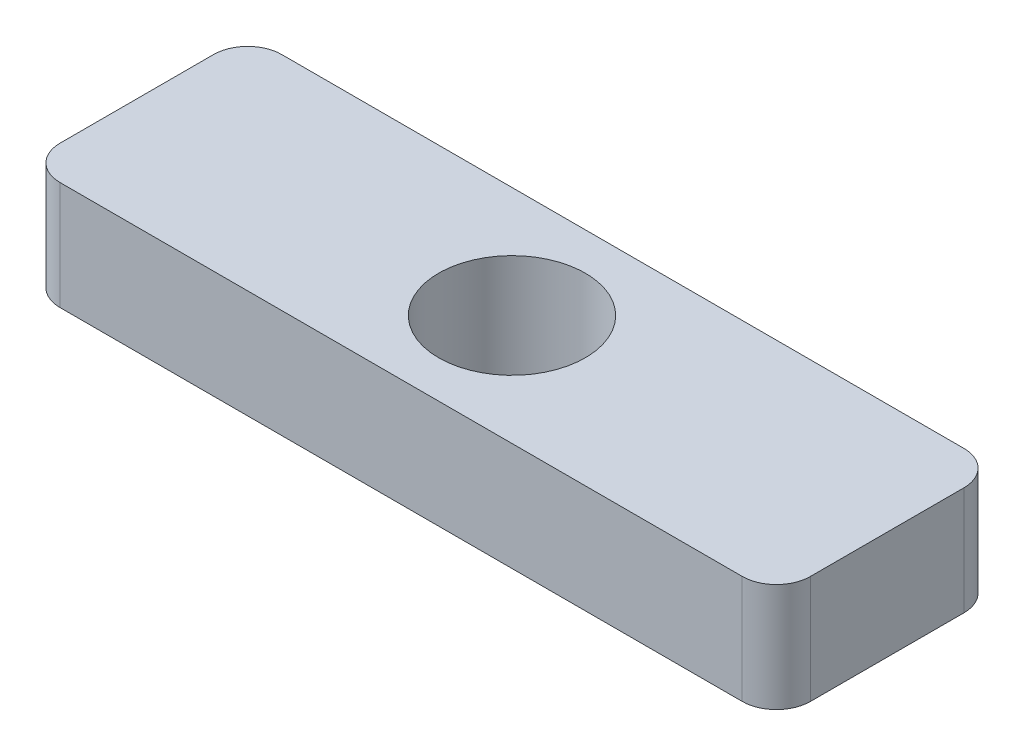
ISO-10303-21;
HEADER;
FILE_DESCRIPTION(('STEP AP214'),'2;1');
FILE_NAME('part.step','',(''),(''),'','','');
FILE_SCHEMA(('AUTOMOTIVE_DESIGN { 1 0 10303 214 1 1 1 1 }'));
ENDSEC;
DATA;
#1=APPLICATION_CONTEXT('core data for automotive mechanical design processes');
#2=APPLICATION_PROTOCOL_DEFINITION('international standard','automotive_design',2000,#1);
#3=PRODUCT_CONTEXT('',#1,'mechanical');
#4=PRODUCT('Part','Part','',(#3));
#5=PRODUCT_RELATED_PRODUCT_CATEGORY('part','',(#4));
#6=PRODUCT_DEFINITION_FORMATION('','',#4);
#7=PRODUCT_DEFINITION_CONTEXT('part definition',#1,'design');
#8=PRODUCT_DEFINITION('design','',#6,#7);
#9=PRODUCT_DEFINITION_SHAPE('','',#8);
#10=(LENGTH_UNIT() NAMED_UNIT(*) SI_UNIT(.MILLI.,.METRE.));
#11=(NAMED_UNIT(*) PLANE_ANGLE_UNIT() SI_UNIT($,.RADIAN.));
#12=(NAMED_UNIT(*) SI_UNIT($,.STERADIAN.) SOLID_ANGLE_UNIT());
#13=UNCERTAINTY_MEASURE_WITH_UNIT(LENGTH_MEASURE(1.E-05),#10,'distance_accuracy_value','');
#14=(GEOMETRIC_REPRESENTATION_CONTEXT(3) GLOBAL_UNCERTAINTY_ASSIGNED_CONTEXT((#13)) GLOBAL_UNIT_ASSIGNED_CONTEXT((#10,
#11,#12)) REPRESENTATION_CONTEXT('',''));
#15=CARTESIAN_POINT('',(0.,0.,0.));
#16=DIRECTION('',(0.,0.,1.));
#17=DIRECTION('',(1.,0.,0.));
#18=AXIS2_PLACEMENT_3D('',#15,#16,#17);
#19=CARTESIAN_POINT('',(11.,3.175,-3.25));
#20=DIRECTION('',(-1.,0.,0.));
#21=DIRECTION('',(0.,0.,1.));
#22=AXIS2_PLACEMENT_3D('',#19,#20,#21);
#23=PLANE('',#22);
#24=DIRECTION('',(0.,0.,-1.));
#25=VECTOR('',#24,1.);
#26=CARTESIAN_POINT('',(11.,3.175,-3.25));
#27=LINE('',#26,#25);
#28=CARTESIAN_POINT('',(11.,3.175,2.25));
#29=VERTEX_POINT('',#28);
#30=CARTESIAN_POINT('',(11.,3.175,-2.25));
#31=VERTEX_POINT('',#30);
#32=EDGE_CURVE('E119',#29,#31,#27,.T.);
#33=ORIENTED_EDGE('',*,*,#32,.F.);
#34=DIRECTION('',(0.,-1.,0.));
#35=VECTOR('',#34,1.);
#36=CARTESIAN_POINT('',(11.,3.175,2.25));
#37=LINE('',#36,#35);
#38=CARTESIAN_POINT('',(11.,0.,2.25));
#39=VERTEX_POINT('',#38);
#40=EDGE_CURVE('E104',#29,#39,#37,.T.);
#41=ORIENTED_EDGE('',*,*,#40,.T.);
#42=DIRECTION('',(0.,0.,-1.));
#43=VECTOR('',#42,1.);
#44=CARTESIAN_POINT('',(11.,0.,-3.25));
#45=LINE('',#44,#43);
#46=CARTESIAN_POINT('',(11.,0.,-2.25));
#47=VERTEX_POINT('',#46);
#48=EDGE_CURVE('E116',#39,#47,#45,.T.);
#49=ORIENTED_EDGE('',*,*,#48,.T.);
#50=DIRECTION('',(0.,-1.,0.));
#51=VECTOR('',#50,1.);
#52=CARTESIAN_POINT('',(11.,3.175,-2.25));
#53=LINE('',#52,#51);
#54=EDGE_CURVE('E121',#47,#31,#53,.F.);
#55=ORIENTED_EDGE('',*,*,#54,.T.);
#56=EDGE_LOOP('',(#33,#41,#49,#55));
#57=FACE_BOUND('',#56,.T.);
#58=ADVANCED_FACE('F35',(#57),#23,.F.);
#59=CARTESIAN_POINT('',(-11.,3.175,-3.25));
#60=DIRECTION('',(0.,0.,1.));
#61=DIRECTION('',(1.,0.,0.));
#62=AXIS2_PLACEMENT_3D('',#59,#60,#61);
#63=PLANE('',#62);
#64=DIRECTION('',(-1.,0.,0.));
#65=VECTOR('',#64,1.);
#66=CARTESIAN_POINT('',(-11.,3.175,-3.25));
#67=LINE('',#66,#65);
#68=CARTESIAN_POINT('',(10.,3.175,-3.25));
#69=VERTEX_POINT('',#68);
#70=CARTESIAN_POINT('',(-10.,3.175,-3.25));
#71=VERTEX_POINT('',#70);
#72=EDGE_CURVE('E174',#69,#71,#67,.T.);
#73=ORIENTED_EDGE('',*,*,#72,.F.);
#74=DIRECTION('',(0.,-1.,0.));
#75=VECTOR('',#74,1.);
#76=CARTESIAN_POINT('',(10.,3.175,-3.25));
#77=LINE('',#76,#75);
#78=CARTESIAN_POINT('',(10.,0.,-3.25));
#79=VERTEX_POINT('',#78);
#80=EDGE_CURVE('E158',#69,#79,#77,.T.);
#81=ORIENTED_EDGE('',*,*,#80,.T.);
#82=DIRECTION('',(-1.,0.,0.));
#83=VECTOR('',#82,1.);
#84=CARTESIAN_POINT('',(-11.,0.,-3.25));
#85=LINE('',#84,#83);
#86=CARTESIAN_POINT('',(-10.,0.,-3.25));
#87=VERTEX_POINT('',#86);
#88=EDGE_CURVE('E125',#79,#87,#85,.T.);
#89=ORIENTED_EDGE('',*,*,#88,.T.);
#90=DIRECTION('',(0.,-1.,0.));
#91=VECTOR('',#90,1.);
#92=CARTESIAN_POINT('',(-10.,3.175,-3.25));
#93=LINE('',#92,#91);
#94=EDGE_CURVE('E156',#87,#71,#93,.F.);
#95=ORIENTED_EDGE('',*,*,#94,.T.);
#96=EDGE_LOOP('',(#73,#81,#89,#95));
#97=FACE_BOUND('',#96,.T.);
#98=ADVANCED_FACE('F195',(#97),#63,.F.);
#99=CARTESIAN_POINT('',(-11.,3.175,-3.25));
#100=DIRECTION('',(1.,0.,0.));
#101=DIRECTION('',(0.,0.,-1.));
#102=AXIS2_PLACEMENT_3D('',#99,#100,#101);
#103=PLANE('',#102);
#104=DIRECTION('',(0.,0.,1.));
#105=VECTOR('',#104,1.);
#106=CARTESIAN_POINT('',(-11.,0.,-3.25));
#107=LINE('',#106,#105);
#108=CARTESIAN_POINT('',(-11.,0.,-2.25));
#109=VERTEX_POINT('',#108);
#110=CARTESIAN_POINT('',(-11.,0.,2.25));
#111=VERTEX_POINT('',#110);
#112=EDGE_CURVE('E129',#109,#111,#107,.T.);
#113=ORIENTED_EDGE('',*,*,#112,.T.);
#114=DIRECTION('',(0.,-1.,0.));
#115=VECTOR('',#114,1.);
#116=CARTESIAN_POINT('',(-11.,3.175,2.25));
#117=LINE('',#116,#115);
#118=CARTESIAN_POINT('',(-11.,3.175,2.25));
#119=VERTEX_POINT('',#118);
#120=EDGE_CURVE('E11',#111,#119,#117,.F.);
#121=ORIENTED_EDGE('',*,*,#120,.T.);
#122=DIRECTION('',(0.,0.,1.));
#123=VECTOR('',#122,1.);
#124=CARTESIAN_POINT('',(-11.,3.175,-3.25));
#125=LINE('',#124,#123);
#126=CARTESIAN_POINT('',(-11.,3.175,-2.25));
#127=VERTEX_POINT('',#126);
#128=EDGE_CURVE('E164',#127,#119,#125,.T.);
#129=ORIENTED_EDGE('',*,*,#128,.F.);
#130=DIRECTION('',(0.,-1.,0.));
#131=VECTOR('',#130,1.);
#132=CARTESIAN_POINT('',(-11.,3.175,-2.25));
#133=LINE('',#132,#131);
#134=EDGE_CURVE('E43',#127,#109,#133,.T.);
#135=ORIENTED_EDGE('',*,*,#134,.T.);
#136=EDGE_LOOP('',(#113,#121,#129,#135));
#137=FACE_BOUND('',#136,.T.);
#138=ADVANCED_FACE('F163',(#137),#103,.F.);
#139=CARTESIAN_POINT('',(-11.,3.175,3.25));
#140=DIRECTION('',(0.,0.,-1.));
#141=DIRECTION('',(-1.,0.,0.));
#142=AXIS2_PLACEMENT_3D('',#139,#140,#141);
#143=PLANE('',#142);
#144=DIRECTION('',(1.,0.,0.));
#145=VECTOR('',#144,1.);
#146=CARTESIAN_POINT('',(-11.,0.,3.25));
#147=LINE('',#146,#145);
#148=CARTESIAN_POINT('',(-10.,0.,3.25));
#149=VERTEX_POINT('',#148);
#150=CARTESIAN_POINT('',(10.,0.,3.25));
#151=VERTEX_POINT('',#150);
#152=EDGE_CURVE('E139',#149,#151,#147,.T.);
#153=ORIENTED_EDGE('',*,*,#152,.T.);
#154=DIRECTION('',(0.,-1.,0.));
#155=VECTOR('',#154,1.);
#156=CARTESIAN_POINT('',(10.,3.175,3.25));
#157=LINE('',#156,#155);
#158=CARTESIAN_POINT('',(10.,3.175,3.25));
#159=VERTEX_POINT('',#158);
#160=EDGE_CURVE('E105',#151,#159,#157,.F.);
#161=ORIENTED_EDGE('',*,*,#160,.T.);
#162=DIRECTION('',(1.,0.,0.));
#163=VECTOR('',#162,1.);
#164=CARTESIAN_POINT('',(-11.,3.175,3.25));
#165=LINE('',#164,#163);
#166=CARTESIAN_POINT('',(-10.,3.175,3.25));
#167=VERTEX_POINT('',#166);
#168=EDGE_CURVE('E135',#167,#159,#165,.T.);
#169=ORIENTED_EDGE('',*,*,#168,.F.);
#170=DIRECTION('',(0.,-1.,0.));
#171=VECTOR('',#170,1.);
#172=CARTESIAN_POINT('',(-10.,3.175,3.25));
#173=LINE('',#172,#171);
#174=EDGE_CURVE('E110',#167,#149,#173,.T.);
#175=ORIENTED_EDGE('',*,*,#174,.T.);
#176=EDGE_LOOP('',(#153,#161,#169,#175));
#177=FACE_BOUND('',#176,.T.);
#178=ADVANCED_FACE('F172',(#177),#143,.F.);
#179=CARTESIAN_POINT('',(0.,3.175,0.));
#180=DIRECTION('',(0.,1.,0.));
#181=DIRECTION('',(0.,0.,1.));
#182=AXIS2_PLACEMENT_3D('',#179,#180,#181);
#183=PLANE('',#182);
#184=CARTESIAN_POINT('',(0.,3.175,0.));
#185=DIRECTION('',(0.,1.,0.));
#186=DIRECTION('',(0.,0.,1.));
#187=AXIS2_PLACEMENT_3D('',#184,#185,#186);
#188=CIRCLE('',#187,2.15);
#189=CARTESIAN_POINT('',(0.,3.175,2.15));
#190=VERTEX_POINT('',#189);
#191=EDGE_CURVE('E132',#190,#190,#188,.T.);
#192=ORIENTED_EDGE('',*,*,#191,.F.);
#193=EDGE_LOOP('',(#192));
#194=FACE_BOUND('',#193,.T.);
#195=ORIENTED_EDGE('',*,*,#168,.T.);
#196=CARTESIAN_POINT('',(10.,3.175,2.25));
#197=DIRECTION('',(0.,1.,0.));
#198=DIRECTION('',(0.,0.,1.));
#199=AXIS2_PLACEMENT_3D('',#196,#197,#198);
#200=CIRCLE('',#199,1.);
#201=EDGE_CURVE('E154',#159,#29,#200,.T.);
#202=ORIENTED_EDGE('',*,*,#201,.T.);
#203=ORIENTED_EDGE('',*,*,#32,.T.);
#204=CARTESIAN_POINT('',(10.,3.175,-2.25));
#205=DIRECTION('',(0.,1.,0.));
#206=DIRECTION('',(0.,0.,1.));
#207=AXIS2_PLACEMENT_3D('',#204,#205,#206);
#208=CIRCLE('',#207,1.);
#209=EDGE_CURVE('E152',#31,#69,#208,.T.);
#210=ORIENTED_EDGE('',*,*,#209,.T.);
#211=ORIENTED_EDGE('',*,*,#72,.T.);
#212=CARTESIAN_POINT('',(-10.,3.175,-2.25));
#213=DIRECTION('',(0.,1.,0.));
#214=DIRECTION('',(0.,0.,1.));
#215=AXIS2_PLACEMENT_3D('',#212,#213,#214);
#216=CIRCLE('',#215,1.);
#217=EDGE_CURVE('E55',#71,#127,#216,.T.);
#218=ORIENTED_EDGE('',*,*,#217,.T.);
#219=ORIENTED_EDGE('',*,*,#128,.T.);
#220=CARTESIAN_POINT('',(-10.,3.175,2.25));
#221=DIRECTION('',(0.,1.,0.));
#222=DIRECTION('',(0.,0.,1.));
#223=AXIS2_PLACEMENT_3D('',#220,#221,#222);
#224=CIRCLE('',#223,1.);
#225=EDGE_CURVE('E150',#119,#167,#224,.T.);
#226=ORIENTED_EDGE('',*,*,#225,.T.);
#227=EDGE_LOOP('',(#195,#202,#203,#210,#211,#218,#219,#226));
#228=FACE_BOUND('',#227,.T.);
#229=ADVANCED_FACE('F183',(#194,#228),#183,.T.);
#230=CARTESIAN_POINT('',(0.,0.,0.));
#231=DIRECTION('',(0.,1.,0.));
#232=DIRECTION('',(0.,0.,1.));
#233=AXIS2_PLACEMENT_3D('',#230,#231,#232);
#234=PLANE('',#233);
#235=CARTESIAN_POINT('',(0.,0.,0.));
#236=DIRECTION('',(0.,1.,0.));
#237=DIRECTION('',(0.,0.,1.));
#238=AXIS2_PLACEMENT_3D('',#235,#236,#237);
#239=CIRCLE('',#238,2.15);
#240=CARTESIAN_POINT('',(0.,0.,2.15));
#241=VERTEX_POINT('',#240);
#242=EDGE_CURVE('E126',#241,#241,#239,.F.);
#243=ORIENTED_EDGE('',*,*,#242,.F.);
#244=EDGE_LOOP('',(#243));
#245=FACE_BOUND('',#244,.T.);
#246=ORIENTED_EDGE('',*,*,#48,.F.);
#247=CARTESIAN_POINT('',(10.,0.,2.25));
#248=DIRECTION('',(0.,1.,0.));
#249=DIRECTION('',(0.,0.,1.));
#250=AXIS2_PLACEMENT_3D('',#247,#248,#249);
#251=CIRCLE('',#250,1.);
#252=EDGE_CURVE('E100',#39,#151,#251,.F.);
#253=ORIENTED_EDGE('',*,*,#252,.T.);
#254=ORIENTED_EDGE('',*,*,#152,.F.);
#255=CARTESIAN_POINT('',(-10.,0.,2.25));
#256=DIRECTION('',(0.,1.,0.));
#257=DIRECTION('',(0.,0.,1.));
#258=AXIS2_PLACEMENT_3D('',#255,#256,#257);
#259=CIRCLE('',#258,1.);
#260=EDGE_CURVE('E143',#149,#111,#259,.F.);
#261=ORIENTED_EDGE('',*,*,#260,.T.);
#262=ORIENTED_EDGE('',*,*,#112,.F.);
#263=CARTESIAN_POINT('',(-10.,0.,-2.25));
#264=DIRECTION('',(0.,1.,0.));
#265=DIRECTION('',(0.,0.,1.));
#266=AXIS2_PLACEMENT_3D('',#263,#264,#265);
#267=CIRCLE('',#266,1.);
#268=EDGE_CURVE('E120',#109,#87,#267,.F.);
#269=ORIENTED_EDGE('',*,*,#268,.T.);
#270=ORIENTED_EDGE('',*,*,#88,.F.);
#271=CARTESIAN_POINT('',(10.,0.,-2.25));
#272=DIRECTION('',(0.,1.,0.));
#273=DIRECTION('',(0.,0.,1.));
#274=AXIS2_PLACEMENT_3D('',#271,#272,#273);
#275=CIRCLE('',#274,1.);
#276=EDGE_CURVE('E111',#79,#47,#275,.F.);
#277=ORIENTED_EDGE('',*,*,#276,.T.);
#278=EDGE_LOOP('',(#246,#253,#254,#261,#262,#269,#270,#277));
#279=FACE_BOUND('',#278,.T.);
#280=ADVANCED_FACE('F123',(#245,#279),#234,.F.);
#281=CARTESIAN_POINT('',(0.,-6.08111831820431,0.));
#282=DIRECTION('',(0.,1.,0.));
#283=DIRECTION('',(0.,0.,1.));
#284=AXIS2_PLACEMENT_3D('',#281,#282,#283);
#285=CYLINDRICAL_SURFACE('',#284,2.15);
#286=ORIENTED_EDGE('',*,*,#242,.T.);
#287=EDGE_LOOP('',(#286));
#288=FACE_BOUND('',#287,.T.);
#289=ORIENTED_EDGE('',*,*,#191,.T.);
#290=EDGE_LOOP('',(#289));
#291=FACE_BOUND('',#290,.T.);
#292=ADVANCED_FACE('F181',(#288,#291),#285,.F.);
#293=CARTESIAN_POINT('',(10.,3.175,2.25));
#294=DIRECTION('',(0.,-1.,0.));
#295=DIRECTION('',(0.,0.,-1.));
#296=AXIS2_PLACEMENT_3D('',#293,#294,#295);
#297=CYLINDRICAL_SURFACE('',#296,1.);
#298=ORIENTED_EDGE('',*,*,#201,.F.);
#299=ORIENTED_EDGE('',*,*,#160,.F.);
#300=ORIENTED_EDGE('',*,*,#252,.F.);
#301=ORIENTED_EDGE('',*,*,#40,.F.);
#302=EDGE_LOOP('',(#298,#299,#300,#301));
#303=FACE_BOUND('',#302,.T.);
#304=ADVANCED_FACE('F103',(#303),#297,.T.);
#305=CARTESIAN_POINT('',(10.,3.175,-2.25));
#306=DIRECTION('',(0.,-1.,0.));
#307=DIRECTION('',(0.,0.,-1.));
#308=AXIS2_PLACEMENT_3D('',#305,#306,#307);
#309=CYLINDRICAL_SURFACE('',#308,1.);
#310=ORIENTED_EDGE('',*,*,#209,.F.);
#311=ORIENTED_EDGE('',*,*,#54,.F.);
#312=ORIENTED_EDGE('',*,*,#276,.F.);
#313=ORIENTED_EDGE('',*,*,#80,.F.);
#314=EDGE_LOOP('',(#310,#311,#312,#313));
#315=FACE_BOUND('',#314,.T.);
#316=ADVANCED_FACE('F206',(#315),#309,.T.);
#317=CARTESIAN_POINT('',(-10.,3.175,2.25));
#318=DIRECTION('',(0.,-1.,0.));
#319=DIRECTION('',(0.,0.,-1.));
#320=AXIS2_PLACEMENT_3D('',#317,#318,#319);
#321=CYLINDRICAL_SURFACE('',#320,1.);
#322=ORIENTED_EDGE('',*,*,#225,.F.);
#323=ORIENTED_EDGE('',*,*,#120,.F.);
#324=ORIENTED_EDGE('',*,*,#260,.F.);
#325=ORIENTED_EDGE('',*,*,#174,.F.);
#326=EDGE_LOOP('',(#322,#323,#324,#325));
#327=FACE_BOUND('',#326,.T.);
#328=ADVANCED_FACE('F169',(#327),#321,.T.);
#329=CARTESIAN_POINT('',(-10.,3.175,-2.25));
#330=DIRECTION('',(0.,-1.,0.));
#331=DIRECTION('',(0.,0.,-1.));
#332=AXIS2_PLACEMENT_3D('',#329,#330,#331);
#333=CYLINDRICAL_SURFACE('',#332,1.);
#334=ORIENTED_EDGE('',*,*,#217,.F.);
#335=ORIENTED_EDGE('',*,*,#94,.F.);
#336=ORIENTED_EDGE('',*,*,#268,.F.);
#337=ORIENTED_EDGE('',*,*,#134,.F.);
#338=EDGE_LOOP('',(#334,#335,#336,#337));
#339=FACE_BOUND('',#338,.T.);
#340=ADVANCED_FACE('F37',(#339),#333,.T.);
#341=CLOSED_SHELL('',(#58,#98,#138,#178,#229,#280,#292,#304,#316,#328,#340));
#342=MANIFOLD_SOLID_BREP('B2',#341);
#343=ADVANCED_BREP_SHAPE_REPRESENTATION('',(#18,#342),#14);
#344=SHAPE_DEFINITION_REPRESENTATION(#9,#343);
ENDSEC;
END-ISO-10303-21;
